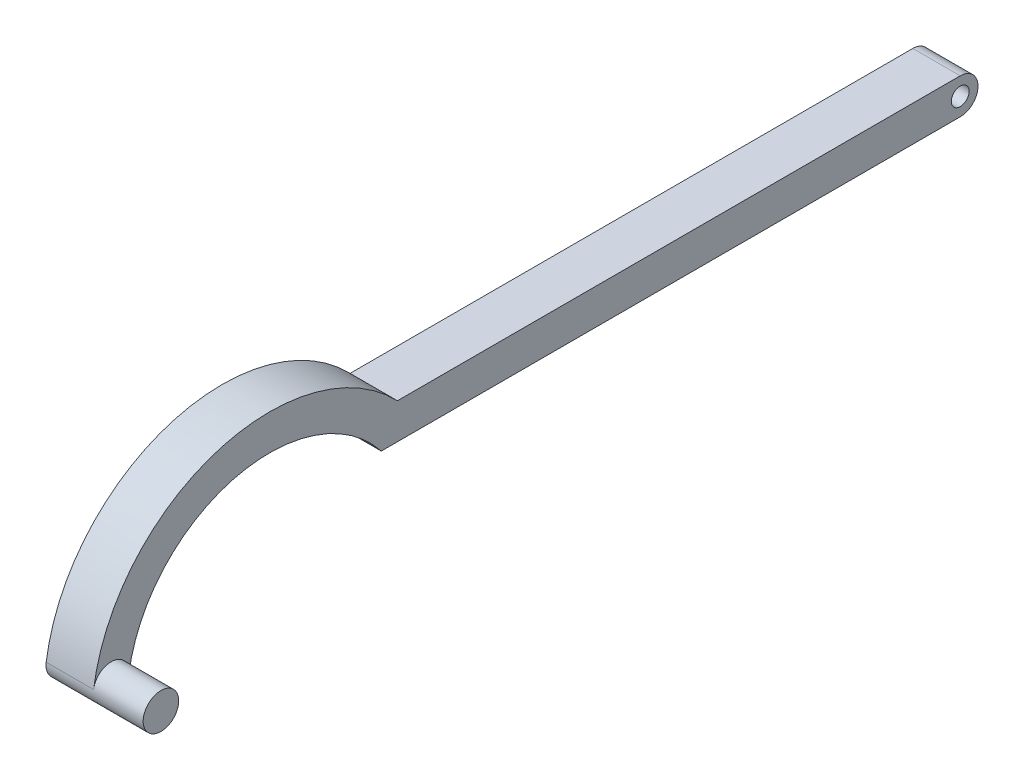
ISO-10303-21;
HEADER;
FILE_DESCRIPTION(('STEP AP214'),'2;1');
FILE_NAME('part.step','',(''),(''),'','','');
FILE_SCHEMA(('AUTOMOTIVE_DESIGN { 1 0 10303 214 1 1 1 1 }'));
ENDSEC;
DATA;
#1=APPLICATION_CONTEXT('core data for automotive mechanical design processes');
#2=APPLICATION_PROTOCOL_DEFINITION('international standard','automotive_design',2000,#1);
#3=PRODUCT_CONTEXT('',#1,'mechanical');
#4=PRODUCT('Part','Part','',(#3));
#5=PRODUCT_RELATED_PRODUCT_CATEGORY('part','',(#4));
#6=PRODUCT_DEFINITION_FORMATION('','',#4);
#7=PRODUCT_DEFINITION_CONTEXT('part definition',#1,'design');
#8=PRODUCT_DEFINITION('design','',#6,#7);
#9=PRODUCT_DEFINITION_SHAPE('','',#8);
#10=(LENGTH_UNIT() NAMED_UNIT(*) SI_UNIT(.MILLI.,.METRE.));
#11=(NAMED_UNIT(*) PLANE_ANGLE_UNIT() SI_UNIT($,.RADIAN.));
#12=(NAMED_UNIT(*) SI_UNIT($,.STERADIAN.) SOLID_ANGLE_UNIT());
#13=UNCERTAINTY_MEASURE_WITH_UNIT(LENGTH_MEASURE(1.E-05),#10,'distance_accuracy_value','');
#14=(GEOMETRIC_REPRESENTATION_CONTEXT(3) GLOBAL_UNCERTAINTY_ASSIGNED_CONTEXT((#13)) GLOBAL_UNIT_ASSIGNED_CONTEXT((#10,
#11,#12)) REPRESENTATION_CONTEXT('',''));
#15=CARTESIAN_POINT('',(0.,0.,0.));
#16=DIRECTION('',(0.,0.,1.));
#17=DIRECTION('',(1.,0.,0.));
#18=AXIS2_PLACEMENT_3D('',#15,#16,#17);
#19=CARTESIAN_POINT('',(4.,7.,-71.6589143093865));
#20=DIRECTION('',(1.,0.,0.));
#21=DIRECTION('',(0.,0.,-1.));
#22=AXIS2_PLACEMENT_3D('',#19,#20,#21);
#23=PLANE('',#22);
#24=CARTESIAN_POINT('',(4.,0.,0.));
#25=DIRECTION('',(1.,0.,0.));
#26=DIRECTION('',(0.,0.,-1.));
#27=AXIS2_PLACEMENT_3D('',#24,#25,#26);
#28=CIRCLE('',#27,1.5);
#29=CARTESIAN_POINT('',(4.,-0.212715152147065,-1.48484082111419));
#30=VERTEX_POINT('',#29);
#31=CARTESIAN_POINT('',(4.,0.212715152147064,1.48484082111418));
#32=VERTEX_POINT('',#31);
#33=EDGE_CURVE('E11',#30,#32,#28,.T.);
#34=ORIENTED_EDGE('',*,*,#33,.F.);
#35=CARTESIAN_POINT('',(4.,-1.91443636932358,-13.3635673900277));
#36=DIRECTION('',(-1.,0.,0.));
#37=DIRECTION('',(0.,0.,1.));
#38=AXIS2_PLACEMENT_3D('',#35,#36,#37);
#39=CIRCLE('',#38,12.);
#40=CARTESIAN_POINT('',(4.,5.49999999999999,-22.7989334838924));
#41=VERTEX_POINT('',#40);
#42=EDGE_CURVE('E98',#30,#41,#39,.T.);
#43=ORIENTED_EDGE('',*,*,#42,.T.);
#44=DIRECTION('',(0.,0.,-1.));
#45=VECTOR('',#44,1.);
#46=CARTESIAN_POINT('',(4.,5.5,-71.6589143093865));
#47=LINE('',#46,#45);
#48=CARTESIAN_POINT('',(4.,5.5,-71.6589143093865));
#49=VERTEX_POINT('',#48);
#50=EDGE_CURVE('E51',#41,#49,#47,.T.);
#51=ORIENTED_EDGE('',*,*,#50,.T.);
#52=CARTESIAN_POINT('',(4.,7.,-71.6589143093865));
#53=DIRECTION('',(1.,0.,0.));
#54=DIRECTION('',(0.,0.,-1.));
#55=AXIS2_PLACEMENT_3D('',#52,#53,#54);
#56=CIRCLE('',#55,1.5);
#57=CARTESIAN_POINT('',(4.,8.5,-71.6589143093865));
#58=VERTEX_POINT('',#57);
#59=EDGE_CURVE('E129',#49,#58,#56,.T.);
#60=ORIENTED_EDGE('',*,*,#59,.T.);
#61=DIRECTION('',(0.,0.,1.));
#62=VECTOR('',#61,1.);
#63=CARTESIAN_POINT('',(4.,8.5,-71.6589143093865));
#64=LINE('',#63,#62);
#65=CARTESIAN_POINT('',(4.,8.5,-24.1589143093865));
#66=VERTEX_POINT('',#65);
#67=EDGE_CURVE('E90',#58,#66,#64,.T.);
#68=ORIENTED_EDGE('',*,*,#67,.T.);
#69=CARTESIAN_POINT('',(4.,-1.91443636932358,-13.3635673900277));
#70=DIRECTION('',(1.,0.,0.));
#71=DIRECTION('',(0.,0.,1.));
#72=AXIS2_PLACEMENT_3D('',#69,#70,#71);
#73=CIRCLE('',#72,15.);
#74=EDGE_CURVE('E100',#66,#32,#73,.T.);
#75=ORIENTED_EDGE('',*,*,#74,.T.);
#76=EDGE_LOOP('',(#34,#43,#51,#60,#68,#75));
#77=FACE_BOUND('',#76,.T.);
#78=CARTESIAN_POINT('',(4.,7.,-71.6589143093865));
#79=DIRECTION('',(1.,0.,0.));
#80=DIRECTION('',(0.,0.,-1.));
#81=AXIS2_PLACEMENT_3D('',#78,#79,#80);
#82=CIRCLE('',#81,0.749999999999999);
#83=CARTESIAN_POINT('',(4.,7.,-72.4089143093865));
#84=VERTEX_POINT('',#83);
#85=EDGE_CURVE('E122',#84,#84,#82,.T.);
#86=ORIENTED_EDGE('',*,*,#85,.F.);
#87=EDGE_LOOP('',(#86));
#88=FACE_BOUND('',#87,.T.);
#89=ADVANCED_FACE('F33',(#77,#88),#23,.T.);
#90=CARTESIAN_POINT('',(0.,7.,-71.6589143093865));
#91=DIRECTION('',(1.,0.,0.));
#92=DIRECTION('',(0.,0.,-1.));
#93=AXIS2_PLACEMENT_3D('',#90,#91,#92);
#94=PLANE('',#93);
#95=CARTESIAN_POINT('',(0.,7.,-71.6589143093865));
#96=DIRECTION('',(1.,0.,0.));
#97=DIRECTION('',(0.,0.,-1.));
#98=AXIS2_PLACEMENT_3D('',#95,#96,#97);
#99=CIRCLE('',#98,1.5);
#100=CARTESIAN_POINT('',(0.,5.5,-71.6589143093865));
#101=VERTEX_POINT('',#100);
#102=CARTESIAN_POINT('',(0.,8.5,-71.6589143093865));
#103=VERTEX_POINT('',#102);
#104=EDGE_CURVE('E118',#101,#103,#99,.T.);
#105=ORIENTED_EDGE('',*,*,#104,.F.);
#106=DIRECTION('',(0.,0.,-1.));
#107=VECTOR('',#106,1.);
#108=CARTESIAN_POINT('',(0.,5.5,-71.6589143093865));
#109=LINE('',#108,#107);
#110=CARTESIAN_POINT('',(0.,5.49999999999999,-22.7989334838924));
#111=VERTEX_POINT('',#110);
#112=EDGE_CURVE('E81',#111,#101,#109,.T.);
#113=ORIENTED_EDGE('',*,*,#112,.F.);
#114=CARTESIAN_POINT('',(0.,-1.91443636932358,-13.3635673900277));
#115=DIRECTION('',(-1.,0.,0.));
#116=DIRECTION('',(0.,0.,1.));
#117=AXIS2_PLACEMENT_3D('',#114,#115,#116);
#118=CIRCLE('',#117,12.);
#119=CARTESIAN_POINT('',(0.,-0.212715152147065,-1.48484082111419));
#120=VERTEX_POINT('',#119);
#121=EDGE_CURVE('E75',#120,#111,#118,.T.);
#122=ORIENTED_EDGE('',*,*,#121,.F.);
#123=CARTESIAN_POINT('',(0.,0.,0.));
#124=DIRECTION('',(1.,0.,0.));
#125=DIRECTION('',(0.,0.,-1.));
#126=AXIS2_PLACEMENT_3D('',#123,#124,#125);
#127=CIRCLE('',#126,1.5);
#128=CARTESIAN_POINT('',(0.,0.212715152147065,1.48484082111418));
#129=VERTEX_POINT('',#128);
#130=EDGE_CURVE('E107',#129,#120,#127,.T.);
#131=ORIENTED_EDGE('',*,*,#130,.F.);
#132=CARTESIAN_POINT('',(0.,-1.91443636932358,-13.3635673900277));
#133=DIRECTION('',(1.,0.,0.));
#134=DIRECTION('',(0.,0.,1.));
#135=AXIS2_PLACEMENT_3D('',#132,#133,#134);
#136=CIRCLE('',#135,15.);
#137=CARTESIAN_POINT('',(0.,8.5,-24.1589143093865));
#138=VERTEX_POINT('',#137);
#139=EDGE_CURVE('E124',#138,#129,#136,.T.);
#140=ORIENTED_EDGE('',*,*,#139,.F.);
#141=DIRECTION('',(0.,0.,1.));
#142=VECTOR('',#141,1.);
#143=CARTESIAN_POINT('',(0.,8.5,-71.6589143093865));
#144=LINE('',#143,#142);
#145=EDGE_CURVE('E121',#103,#138,#144,.T.);
#146=ORIENTED_EDGE('',*,*,#145,.F.);
#147=EDGE_LOOP('',(#105,#113,#122,#131,#140,#146));
#148=FACE_BOUND('',#147,.T.);
#149=CARTESIAN_POINT('',(0.,7.,-71.6589143093865));
#150=DIRECTION('',(1.,0.,0.));
#151=DIRECTION('',(0.,0.,-1.));
#152=AXIS2_PLACEMENT_3D('',#149,#150,#151);
#153=CIRCLE('',#152,0.749999999999999);
#154=CARTESIAN_POINT('',(0.,7.,-72.4089143093865));
#155=VERTEX_POINT('',#154);
#156=EDGE_CURVE('E235',#155,#155,#153,.T.);
#157=ORIENTED_EDGE('',*,*,#156,.T.);
#158=EDGE_LOOP('',(#157));
#159=FACE_BOUND('',#158,.T.);
#160=ADVANCED_FACE('F142',(#148,#159),#94,.F.);
#161=CARTESIAN_POINT('',(4.,7.,-71.6589143093865));
#162=DIRECTION('',(-1.,0.,0.));
#163=DIRECTION('',(0.,0.,1.));
#164=AXIS2_PLACEMENT_3D('',#161,#162,#163);
#165=CYLINDRICAL_SURFACE('',#164,1.5);
#166=ORIENTED_EDGE('',*,*,#104,.T.);
#167=DIRECTION('',(-1.,0.,0.));
#168=VECTOR('',#167,1.);
#169=CARTESIAN_POINT('',(4.,8.5,-71.6589143093865));
#170=LINE('',#169,#168);
#171=EDGE_CURVE('E37',#58,#103,#170,.T.);
#172=ORIENTED_EDGE('',*,*,#171,.F.);
#173=ORIENTED_EDGE('',*,*,#59,.F.);
#174=DIRECTION('',(-1.,0.,0.));
#175=VECTOR('',#174,1.);
#176=CARTESIAN_POINT('',(4.,5.5,-71.6589143093865));
#177=LINE('',#176,#175);
#178=EDGE_CURVE('E113',#49,#101,#177,.T.);
#179=ORIENTED_EDGE('',*,*,#178,.T.);
#180=EDGE_LOOP('',(#166,#172,#173,#179));
#181=FACE_BOUND('',#180,.T.);
#182=ADVANCED_FACE('F35',(#181),#165,.T.);
#183=CARTESIAN_POINT('',(4.,8.5,-71.6589143093865));
#184=DIRECTION('',(0.,-1.,0.));
#185=DIRECTION('',(0.,0.,-1.));
#186=AXIS2_PLACEMENT_3D('',#183,#184,#185);
#187=PLANE('',#186);
#188=ORIENTED_EDGE('',*,*,#145,.T.);
#189=DIRECTION('',(-1.,0.,0.));
#190=VECTOR('',#189,1.);
#191=CARTESIAN_POINT('',(4.,8.5,-24.1589143093865));
#192=LINE('',#191,#190);
#193=EDGE_CURVE('E132',#66,#138,#192,.T.);
#194=ORIENTED_EDGE('',*,*,#193,.F.);
#195=ORIENTED_EDGE('',*,*,#67,.F.);
#196=ORIENTED_EDGE('',*,*,#171,.T.);
#197=EDGE_LOOP('',(#188,#194,#195,#196));
#198=FACE_BOUND('',#197,.T.);
#199=ADVANCED_FACE('F137',(#198),#187,.F.);
#200=CARTESIAN_POINT('',(4.,-1.91443636932358,-13.3635673900277));
#201=DIRECTION('',(-1.,0.,0.));
#202=DIRECTION('',(0.,0.,1.));
#203=AXIS2_PLACEMENT_3D('',#200,#201,#202);
#204=CYLINDRICAL_SURFACE('',#203,15.);
#205=ORIENTED_EDGE('',*,*,#139,.T.);
#206=DIRECTION('',(-1.,0.,0.));
#207=VECTOR('',#206,1.);
#208=CARTESIAN_POINT('',(4.,0.212715152147065,1.48484082111418));
#209=LINE('',#208,#207);
#210=EDGE_CURVE('E108',#32,#129,#209,.T.);
#211=ORIENTED_EDGE('',*,*,#210,.F.);
#212=ORIENTED_EDGE('',*,*,#74,.F.);
#213=ORIENTED_EDGE('',*,*,#193,.T.);
#214=EDGE_LOOP('',(#205,#211,#212,#213));
#215=FACE_BOUND('',#214,.T.);
#216=ADVANCED_FACE('F145',(#215),#204,.T.);
#217=CARTESIAN_POINT('',(4.,0.,0.));
#218=DIRECTION('',(-1.,0.,0.));
#219=DIRECTION('',(0.,0.,1.));
#220=AXIS2_PLACEMENT_3D('',#217,#218,#219);
#221=CYLINDRICAL_SURFACE('',#220,1.5);
#222=ORIENTED_EDGE('',*,*,#130,.T.);
#223=DIRECTION('',(-1.,0.,0.));
#224=VECTOR('',#223,1.);
#225=CARTESIAN_POINT('',(4.,-0.212715152147065,-1.48484082111419));
#226=LINE('',#225,#224);
#227=EDGE_CURVE('E103',#30,#120,#226,.T.);
#228=ORIENTED_EDGE('',*,*,#227,.F.);
#229=ORIENTED_EDGE('',*,*,#33,.T.);
#230=ORIENTED_EDGE('',*,*,#210,.T.);
#231=EDGE_LOOP('',(#222,#228,#229,#230));
#232=FACE_BOUND('',#231,.T.);
#233=CARTESIAN_POINT('',(8.2,0.,0.));
#234=DIRECTION('',(1.,0.,0.));
#235=DIRECTION('',(0.,0.,-1.));
#236=AXIS2_PLACEMENT_3D('',#233,#234,#235);
#237=CIRCLE('',#236,1.5);
#238=CARTESIAN_POINT('',(8.2,0.,-1.5));
#239=VERTEX_POINT('',#238);
#240=EDGE_CURVE('E234',#239,#239,#237,.T.);
#241=ORIENTED_EDGE('',*,*,#240,.F.);
#242=EDGE_LOOP('',(#241));
#243=FACE_BOUND('',#242,.T.);
#244=ADVANCED_FACE('F104',(#232,#243),#221,.T.);
#245=CARTESIAN_POINT('',(4.,-1.91443636932358,-13.3635673900277));
#246=DIRECTION('',(-1.,0.,0.));
#247=DIRECTION('',(0.,0.,1.));
#248=AXIS2_PLACEMENT_3D('',#245,#246,#247);
#249=CYLINDRICAL_SURFACE('',#248,12.);
#250=ORIENTED_EDGE('',*,*,#121,.T.);
#251=DIRECTION('',(-1.,0.,0.));
#252=VECTOR('',#251,1.);
#253=CARTESIAN_POINT('',(4.,5.49999999999999,-22.7989334838924));
#254=LINE('',#253,#252);
#255=EDGE_CURVE('E109',#41,#111,#254,.T.);
#256=ORIENTED_EDGE('',*,*,#255,.F.);
#257=ORIENTED_EDGE('',*,*,#42,.F.);
#258=ORIENTED_EDGE('',*,*,#227,.T.);
#259=EDGE_LOOP('',(#250,#256,#257,#258));
#260=FACE_BOUND('',#259,.T.);
#261=ADVANCED_FACE('F111',(#260),#249,.F.);
#262=CARTESIAN_POINT('',(4.,5.5,-71.6589143093865));
#263=DIRECTION('',(0.,1.,0.));
#264=DIRECTION('',(0.,0.,1.));
#265=AXIS2_PLACEMENT_3D('',#262,#263,#264);
#266=PLANE('',#265);
#267=ORIENTED_EDGE('',*,*,#112,.T.);
#268=ORIENTED_EDGE('',*,*,#178,.F.);
#269=ORIENTED_EDGE('',*,*,#50,.F.);
#270=ORIENTED_EDGE('',*,*,#255,.T.);
#271=EDGE_LOOP('',(#267,#268,#269,#270));
#272=FACE_BOUND('',#271,.T.);
#273=ADVANCED_FACE('F163',(#272),#266,.F.);
#274=CARTESIAN_POINT('',(4.,7.,-71.6589143093865));
#275=DIRECTION('',(-1.,0.,0.));
#276=DIRECTION('',(0.,0.,1.));
#277=AXIS2_PLACEMENT_3D('',#274,#275,#276);
#278=CYLINDRICAL_SURFACE('',#277,0.749999999999999);
#279=ORIENTED_EDGE('',*,*,#85,.T.);
#280=EDGE_LOOP('',(#279));
#281=FACE_BOUND('',#280,.T.);
#282=ORIENTED_EDGE('',*,*,#156,.F.);
#283=EDGE_LOOP('',(#282));
#284=FACE_BOUND('',#283,.T.);
#285=ADVANCED_FACE('F160',(#281,#284),#278,.F.);
#286=CARTESIAN_POINT('',(8.2,0.,0.));
#287=DIRECTION('',(1.,0.,0.));
#288=DIRECTION('',(0.,0.,-1.));
#289=AXIS2_PLACEMENT_3D('',#286,#287,#288);
#290=PLANE('',#289);
#291=ORIENTED_EDGE('',*,*,#240,.T.);
#292=EDGE_LOOP('',(#291));
#293=FACE_BOUND('',#292,.T.);
#294=ADVANCED_FACE('F182',(#293),#290,.T.);
#295=CLOSED_SHELL('',(#89,#160,#182,#199,#216,#244,#261,#273,#285,#294));
#296=MANIFOLD_SOLID_BREP('B2',#295);
#297=ADVANCED_BREP_SHAPE_REPRESENTATION('',(#18,#296),#14);
#298=SHAPE_DEFINITION_REPRESENTATION(#9,#297);
ENDSEC;
END-ISO-10303-21;
